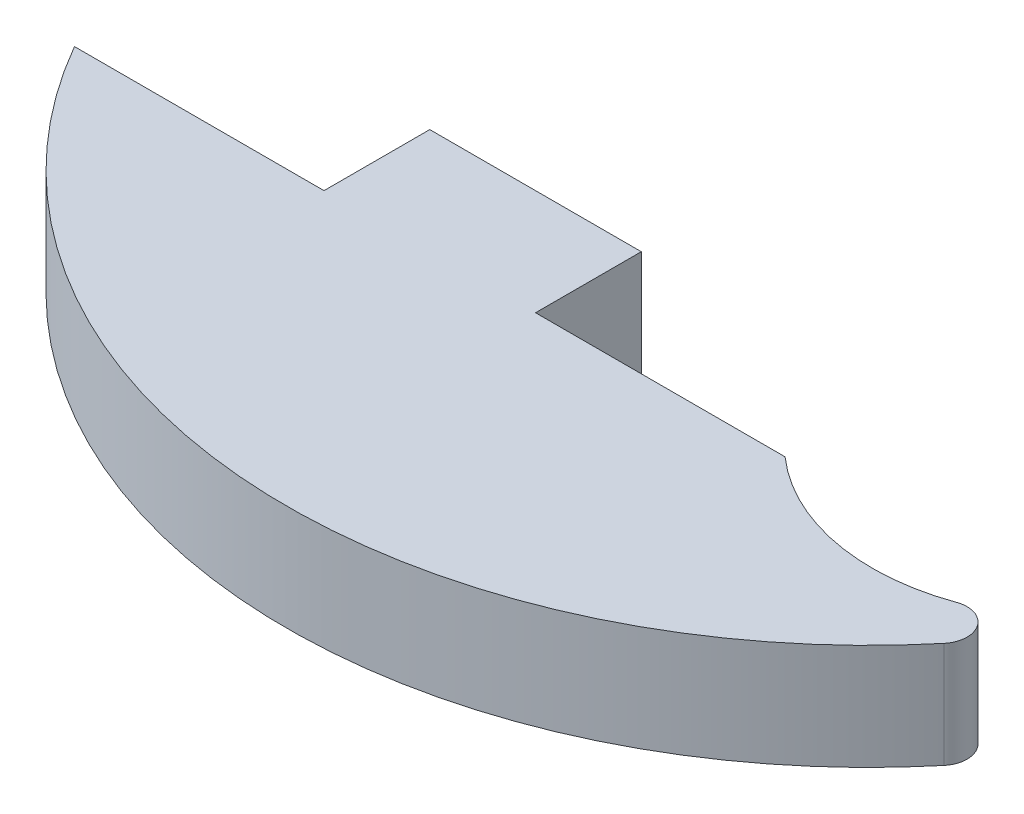
ISO-10303-21;
HEADER;
FILE_DESCRIPTION(('STEP AP214'),'2;1');
FILE_NAME('part.step','',(''),(''),'','','');
FILE_SCHEMA(('AUTOMOTIVE_DESIGN { 1 0 10303 214 1 1 1 1 }'));
ENDSEC;
DATA;
#1=APPLICATION_CONTEXT('core data for automotive mechanical design processes');
#2=APPLICATION_PROTOCOL_DEFINITION('international standard','automotive_design',2000,#1);
#3=PRODUCT_CONTEXT('',#1,'mechanical');
#4=PRODUCT('Part','Part','',(#3));
#5=PRODUCT_RELATED_PRODUCT_CATEGORY('part','',(#4));
#6=PRODUCT_DEFINITION_FORMATION('','',#4);
#7=PRODUCT_DEFINITION_CONTEXT('part definition',#1,'design');
#8=PRODUCT_DEFINITION('design','',#6,#7);
#9=PRODUCT_DEFINITION_SHAPE('','',#8);
#10=(LENGTH_UNIT() NAMED_UNIT(*) SI_UNIT(.MILLI.,.METRE.));
#11=(NAMED_UNIT(*) PLANE_ANGLE_UNIT() SI_UNIT($,.RADIAN.));
#12=(NAMED_UNIT(*) SI_UNIT($,.STERADIAN.) SOLID_ANGLE_UNIT());
#13=UNCERTAINTY_MEASURE_WITH_UNIT(LENGTH_MEASURE(1.E-05),#10,'distance_accuracy_value','');
#14=(GEOMETRIC_REPRESENTATION_CONTEXT(3) GLOBAL_UNCERTAINTY_ASSIGNED_CONTEXT((#13)) GLOBAL_UNIT_ASSIGNED_CONTEXT((#10,
#11,#12)) REPRESENTATION_CONTEXT('',''));
#15=CARTESIAN_POINT('',(0.,0.,0.));
#16=DIRECTION('',(0.,0.,1.));
#17=DIRECTION('',(1.,0.,0.));
#18=AXIS2_PLACEMENT_3D('',#15,#16,#17);
#19=CARTESIAN_POINT('',(0.,3.175,43.1808561922985));
#20=DIRECTION('',(0.,0.,-1.));
#21=DIRECTION('',(-1.,0.,0.));
#22=AXIS2_PLACEMENT_3D('',#19,#20,#21);
#23=PLANE('',#22);
#24=DIRECTION('',(1.,0.,0.));
#25=VECTOR('',#24,1.);
#26=CARTESIAN_POINT('',(0.,3.175,43.1808561922985));
#27=LINE('',#26,#25);
#28=CARTESIAN_POINT('',(-66.9024432577782,3.175,43.1808561922985));
#29=VERTEX_POINT('',#28);
#30=CARTESIAN_POINT('',(-51.9192234640934,3.175,43.1808561922985));
#31=VERTEX_POINT('',#30);
#32=EDGE_CURVE('E116',#29,#31,#27,.T.);
#33=ORIENTED_EDGE('',*,*,#32,.T.);
#34=DIRECTION('',(0.,1.,0.));
#35=VECTOR('',#34,1.);
#36=CARTESIAN_POINT('',(-51.9192234640934,-3.175,43.1808561922985));
#37=LINE('',#36,#35);
#38=CARTESIAN_POINT('',(-51.9192234640934,-3.175,43.1808561922985));
#39=VERTEX_POINT('',#38);
#40=EDGE_CURVE('E103',#39,#31,#37,.T.);
#41=ORIENTED_EDGE('',*,*,#40,.F.);
#42=DIRECTION('',(1.,0.,0.));
#43=VECTOR('',#42,1.);
#44=CARTESIAN_POINT('',(0.,-3.175,43.1808561922985));
#45=LINE('',#44,#43);
#46=CARTESIAN_POINT('',(-66.9024432577782,-3.175,43.1808561922985));
#47=VERTEX_POINT('',#46);
#48=EDGE_CURVE('E114',#47,#39,#45,.T.);
#49=ORIENTED_EDGE('',*,*,#48,.F.);
#50=DIRECTION('',(0.,-1.,0.));
#51=VECTOR('',#50,1.);
#52=CARTESIAN_POINT('',(-66.9024432577782,3.175,43.1808561922985));
#53=LINE('',#52,#51);
#54=EDGE_CURVE('E132',#29,#47,#53,.T.);
#55=ORIENTED_EDGE('',*,*,#54,.F.);
#56=EDGE_LOOP('',(#33,#41,#49,#55));
#57=FACE_BOUND('',#56,.T.);
#58=ADVANCED_FACE('F35',(#57),#23,.T.);
#59=CARTESIAN_POINT('',(-15.8357432577784,3.175,33.6558561922985));
#60=DIRECTION('',(0.,-1.,0.));
#61=DIRECTION('',(0.,0.,-1.));
#62=AXIS2_PLACEMENT_3D('',#59,#60,#61);
#63=CYLINDRICAL_SURFACE('',#62,12.7);
#64=CARTESIAN_POINT('',(-15.8357432577784,3.175,33.6558561922985));
#65=DIRECTION('',(0.,1.,0.));
#66=DIRECTION('',(0.,0.,1.));
#67=AXIS2_PLACEMENT_3D('',#64,#65,#66);
#68=CIRCLE('',#67,12.7);
#69=CARTESIAN_POINT('',(-24.2360036704085,3.175,43.1808561922985));
#70=VERTEX_POINT('',#69);
#71=CARTESIAN_POINT('',(-11.5225107862267,3.175,45.6009817942481));
#72=VERTEX_POINT('',#71);
#73=EDGE_CURVE('E126',#70,#72,#68,.T.);
#74=ORIENTED_EDGE('',*,*,#73,.T.);
#75=DIRECTION('',(0.,-1.,0.));
#76=VECTOR('',#75,1.);
#77=CARTESIAN_POINT('',(-11.5225107862267,3.175,45.6009817942481));
#78=LINE('',#77,#76);
#79=CARTESIAN_POINT('',(-11.5225107862267,-3.175,45.6009817942481));
#80=VERTEX_POINT('',#79);
#81=EDGE_CURVE('E138',#72,#80,#78,.T.);
#82=ORIENTED_EDGE('',*,*,#81,.T.);
#83=CARTESIAN_POINT('',(-15.8357432577784,-3.175,33.6558561922985));
#84=DIRECTION('',(0.,1.,0.));
#85=DIRECTION('',(0.,0.,1.));
#86=AXIS2_PLACEMENT_3D('',#83,#84,#85);
#87=CIRCLE('',#86,12.7);
#88=CARTESIAN_POINT('',(-24.2360036704085,-3.175,43.1808561922985));
#89=VERTEX_POINT('',#88);
#90=EDGE_CURVE('E128',#89,#80,#87,.T.);
#91=ORIENTED_EDGE('',*,*,#90,.F.);
#92=DIRECTION('',(0.,-1.,0.));
#93=VECTOR('',#92,1.);
#94=CARTESIAN_POINT('',(-24.2360036704085,3.175,43.1808561922985));
#95=LINE('',#94,#93);
#96=EDGE_CURVE('E134',#70,#89,#95,.T.);
#97=ORIENTED_EDGE('',*,*,#96,.F.);
#98=EDGE_LOOP('',(#74,#82,#91,#97));
#99=FACE_BOUND('',#98,.T.);
#100=ADVANCED_FACE('F154',(#99),#63,.F.);
#101=DIRECTION('',(0.,1.,0.));
#102=VECTOR('',#101,1.);
#103=CARTESIAN_POINT('',(-39.2192234640934,-3.175,43.1808561922985));
#104=LINE('',#103,#102);
#105=CARTESIAN_POINT('',(-39.2192234640934,-3.175,43.1808561922985));
#106=VERTEX_POINT('',#105);
#107=CARTESIAN_POINT('',(-39.2192234640934,3.175,43.1808561922985));
#108=VERTEX_POINT('',#107);
#109=EDGE_CURVE('E117',#106,#108,#104,.T.);
#110=ORIENTED_EDGE('',*,*,#109,.T.);
#111=EDGE_CURVE('E155',#108,#70,#27,.T.);
#112=ORIENTED_EDGE('',*,*,#111,.T.);
#113=ORIENTED_EDGE('',*,*,#96,.T.);
#114=EDGE_CURVE('E124',#106,#89,#45,.T.);
#115=ORIENTED_EDGE('',*,*,#114,.F.);
#116=EDGE_LOOP('',(#110,#112,#113,#115));
#117=FACE_BOUND('',#116,.T.);
#118=ADVANCED_FACE('F175',(#117),#23,.T.);
#119=CARTESIAN_POINT('',(-36.6194720789578,3.175,25.7826585390146));
#120=DIRECTION('',(0.,-1.,0.));
#121=DIRECTION('',(0.,0.,-1.));
#122=AXIS2_PLACEMENT_3D('',#119,#120,#121);
#123=CYLINDRICAL_SURFACE('',#122,34.925);
#124=CARTESIAN_POINT('',(-36.6194720789578,-3.175,25.7826585390146));
#125=DIRECTION('',(0.,1.,0.));
#126=DIRECTION('',(0.,0.,1.));
#127=AXIS2_PLACEMENT_3D('',#124,#125,#126);
#128=CIRCLE('',#127,34.925);
#129=CARTESIAN_POINT('',(-9.76258932958387,-3.175,48.1089541114193));
#130=VERTEX_POINT('',#129);
#131=EDGE_CURVE('E122',#130,#47,#128,.F.);
#132=ORIENTED_EDGE('',*,*,#131,.F.);
#133=DIRECTION('',(0.,-1.,0.));
#134=VECTOR('',#133,1.);
#135=CARTESIAN_POINT('',(-9.76258932958387,3.175,48.1089541114193));
#136=LINE('',#135,#134);
#137=CARTESIAN_POINT('',(-9.76258932958387,3.175,48.1089541114193));
#138=VERTEX_POINT('',#137);
#139=EDGE_CURVE('E43',#130,#138,#136,.F.);
#140=ORIENTED_EDGE('',*,*,#139,.T.);
#141=CARTESIAN_POINT('',(-36.6194720789578,3.175,25.7826585390146));
#142=DIRECTION('',(0.,1.,0.));
#143=DIRECTION('',(0.,0.,1.));
#144=AXIS2_PLACEMENT_3D('',#141,#142,#143);
#145=CIRCLE('',#144,34.925);
#146=EDGE_CURVE('E135',#138,#29,#145,.F.);
#147=ORIENTED_EDGE('',*,*,#146,.T.);
#148=ORIENTED_EDGE('',*,*,#54,.T.);
#149=EDGE_LOOP('',(#132,#140,#147,#148));
#150=FACE_BOUND('',#149,.T.);
#151=ADVANCED_FACE('F145',(#150),#123,.T.);
#152=CARTESIAN_POINT('',(0.,3.175,0.));
#153=DIRECTION('',(0.,1.,0.));
#154=DIRECTION('',(0.,0.,1.));
#155=AXIS2_PLACEMENT_3D('',#152,#153,#154);
#156=PLANE('',#155);
#157=ORIENTED_EDGE('',*,*,#146,.F.);
#158=CARTESIAN_POINT('',(-10.9833567272827,3.175,47.0941224944918));
#159=DIRECTION('',(0.,1.,0.));
#160=DIRECTION('',(0.,0.,1.));
#161=AXIS2_PLACEMENT_3D('',#158,#159,#160);
#162=CIRCLE('',#161,1.5875);
#163=EDGE_CURVE('E11',#138,#72,#162,.T.);
#164=ORIENTED_EDGE('',*,*,#163,.T.);
#165=ORIENTED_EDGE('',*,*,#73,.F.);
#166=ORIENTED_EDGE('',*,*,#111,.F.);
#167=DIRECTION('',(0.,0.,-1.));
#168=VECTOR('',#167,1.);
#169=CARTESIAN_POINT('',(-39.2192234640934,3.175,0.));
#170=LINE('',#169,#168);
#171=CARTESIAN_POINT('',(-39.2192234640934,3.175,36.8308561922997));
#172=VERTEX_POINT('',#171);
#173=EDGE_CURVE('E163',#108,#172,#170,.T.);
#174=ORIENTED_EDGE('',*,*,#173,.T.);
#175=DIRECTION('',(-1.,0.,0.));
#176=VECTOR('',#175,1.);
#177=CARTESIAN_POINT('',(0.,3.175,36.8308561922997));
#178=LINE('',#177,#176);
#179=CARTESIAN_POINT('',(-51.9192234640934,3.175,36.8308561922997));
#180=VERTEX_POINT('',#179);
#181=EDGE_CURVE('E108',#172,#180,#178,.T.);
#182=ORIENTED_EDGE('',*,*,#181,.T.);
#183=DIRECTION('',(0.,0.,-1.));
#184=VECTOR('',#183,1.);
#185=CARTESIAN_POINT('',(-51.9192234640934,3.175,0.));
#186=LINE('',#185,#184);
#187=EDGE_CURVE('E160',#31,#180,#186,.T.);
#188=ORIENTED_EDGE('',*,*,#187,.F.);
#189=ORIENTED_EDGE('',*,*,#32,.F.);
#190=EDGE_LOOP('',(#157,#164,#165,#166,#174,#182,#188,#189));
#191=FACE_BOUND('',#190,.T.);
#192=ADVANCED_FACE('F150',(#191),#156,.T.);
#193=CARTESIAN_POINT('',(0.,-3.175,0.));
#194=DIRECTION('',(0.,1.,0.));
#195=DIRECTION('',(0.,0.,1.));
#196=AXIS2_PLACEMENT_3D('',#193,#194,#195);
#197=PLANE('',#196);
#198=ORIENTED_EDGE('',*,*,#90,.T.);
#199=CARTESIAN_POINT('',(-10.9833567272827,-3.175,47.0941224944918));
#200=DIRECTION('',(0.,1.,0.));
#201=DIRECTION('',(0.,0.,1.));
#202=AXIS2_PLACEMENT_3D('',#199,#200,#201);
#203=CIRCLE('',#202,1.5875);
#204=EDGE_CURVE('E141',#80,#130,#203,.F.);
#205=ORIENTED_EDGE('',*,*,#204,.T.);
#206=ORIENTED_EDGE('',*,*,#131,.T.);
#207=ORIENTED_EDGE('',*,*,#48,.T.);
#208=DIRECTION('',(0.,0.,-1.));
#209=VECTOR('',#208,1.);
#210=CARTESIAN_POINT('',(-51.9192234640934,-3.175,0.));
#211=LINE('',#210,#209);
#212=CARTESIAN_POINT('',(-51.9192234640934,-3.175,36.8308561922997));
#213=VERTEX_POINT('',#212);
#214=EDGE_CURVE('E99',#39,#213,#211,.T.);
#215=ORIENTED_EDGE('',*,*,#214,.T.);
#216=DIRECTION('',(-1.,0.,0.));
#217=VECTOR('',#216,1.);
#218=CARTESIAN_POINT('',(0.,-3.175,36.8308561922997));
#219=LINE('',#218,#217);
#220=CARTESIAN_POINT('',(-39.2192234640934,-3.175,36.8308561922997));
#221=VERTEX_POINT('',#220);
#222=EDGE_CURVE('E118',#221,#213,#219,.T.);
#223=ORIENTED_EDGE('',*,*,#222,.F.);
#224=DIRECTION('',(0.,0.,-1.));
#225=VECTOR('',#224,1.);
#226=CARTESIAN_POINT('',(-39.2192234640934,-3.175,0.));
#227=LINE('',#226,#225);
#228=EDGE_CURVE('E50',#106,#221,#227,.T.);
#229=ORIENTED_EDGE('',*,*,#228,.F.);
#230=ORIENTED_EDGE('',*,*,#114,.T.);
#231=EDGE_LOOP('',(#198,#205,#206,#207,#215,#223,#229,#230));
#232=FACE_BOUND('',#231,.T.);
#233=ADVANCED_FACE('F121',(#232),#197,.F.);
#234=CARTESIAN_POINT('',(-10.9833567272827,3.175,47.0941224944918));
#235=DIRECTION('',(0.,1.,0.));
#236=DIRECTION('',(0.,0.,1.));
#237=AXIS2_PLACEMENT_3D('',#234,#235,#236);
#238=CYLINDRICAL_SURFACE('',#237,1.5875);
#239=ORIENTED_EDGE('',*,*,#163,.F.);
#240=ORIENTED_EDGE('',*,*,#139,.F.);
#241=ORIENTED_EDGE('',*,*,#204,.F.);
#242=ORIENTED_EDGE('',*,*,#81,.F.);
#243=EDGE_LOOP('',(#239,#240,#241,#242));
#244=FACE_BOUND('',#243,.T.);
#245=ADVANCED_FACE('F37',(#244),#238,.T.);
#246=CARTESIAN_POINT('',(-51.9192234640934,-3.175,0.));
#247=DIRECTION('',(1.,0.,0.));
#248=DIRECTION('',(0.,0.,-1.));
#249=AXIS2_PLACEMENT_3D('',#246,#247,#248);
#250=PLANE('',#249);
#251=ORIENTED_EDGE('',*,*,#187,.T.);
#252=DIRECTION('',(0.,1.,0.));
#253=VECTOR('',#252,1.);
#254=CARTESIAN_POINT('',(-51.9192234640934,-3.175,36.8308561922997));
#255=LINE('',#254,#253);
#256=EDGE_CURVE('E105',#213,#180,#255,.T.);
#257=ORIENTED_EDGE('',*,*,#256,.F.);
#258=ORIENTED_EDGE('',*,*,#214,.F.);
#259=ORIENTED_EDGE('',*,*,#40,.T.);
#260=EDGE_LOOP('',(#251,#257,#258,#259));
#261=FACE_BOUND('',#260,.T.);
#262=ADVANCED_FACE('F102',(#261),#250,.F.);
#263=CARTESIAN_POINT('',(0.,-3.175,36.8308561922997));
#264=DIRECTION('',(0.,0.,-1.));
#265=DIRECTION('',(-1.,0.,0.));
#266=AXIS2_PLACEMENT_3D('',#263,#264,#265);
#267=PLANE('',#266);
#268=ORIENTED_EDGE('',*,*,#181,.F.);
#269=DIRECTION('',(0.,1.,0.));
#270=VECTOR('',#269,1.);
#271=CARTESIAN_POINT('',(-39.2192234640934,-3.175,36.8308561922997));
#272=LINE('',#271,#270);
#273=EDGE_CURVE('E171',#221,#172,#272,.T.);
#274=ORIENTED_EDGE('',*,*,#273,.F.);
#275=ORIENTED_EDGE('',*,*,#222,.T.);
#276=ORIENTED_EDGE('',*,*,#256,.T.);
#277=EDGE_LOOP('',(#268,#274,#275,#276));
#278=FACE_BOUND('',#277,.T.);
#279=ADVANCED_FACE('F178',(#278),#267,.T.);
#280=CARTESIAN_POINT('',(-39.2192234640934,-3.175,0.));
#281=DIRECTION('',(1.,0.,0.));
#282=DIRECTION('',(0.,0.,-1.));
#283=AXIS2_PLACEMENT_3D('',#280,#281,#282);
#284=PLANE('',#283);
#285=ORIENTED_EDGE('',*,*,#173,.F.);
#286=ORIENTED_EDGE('',*,*,#109,.F.);
#287=ORIENTED_EDGE('',*,*,#228,.T.);
#288=ORIENTED_EDGE('',*,*,#273,.T.);
#289=EDGE_LOOP('',(#285,#286,#287,#288));
#290=FACE_BOUND('',#289,.T.);
#291=ADVANCED_FACE('F179',(#290),#284,.T.);
#292=CLOSED_SHELL('',(#58,#100,#118,#151,#192,#233,#245,#262,#279,#291));
#293=MANIFOLD_SOLID_BREP('B2',#292);
#294=ADVANCED_BREP_SHAPE_REPRESENTATION('',(#18,#293),#14);
#295=SHAPE_DEFINITION_REPRESENTATION(#9,#294);
ENDSEC;
END-ISO-10303-21;
